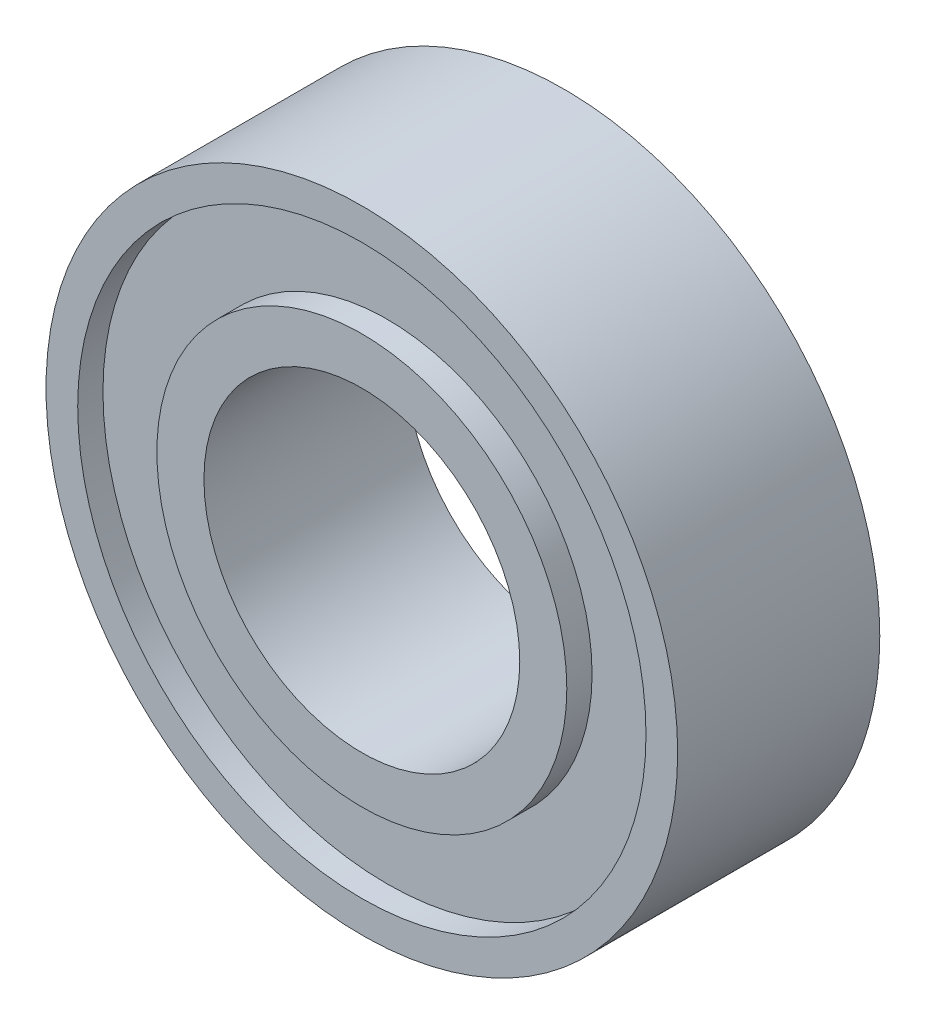
ISO-10303-21;
HEADER;
FILE_DESCRIPTION(('STEP AP214'),'2;1');
FILE_NAME('part.step','',(''),(''),'','','');
FILE_SCHEMA(('AUTOMOTIVE_DESIGN { 1 0 10303 214 1 1 1 1 }'));
ENDSEC;
DATA;
#1=APPLICATION_CONTEXT('core data for automotive mechanical design processes');
#2=APPLICATION_PROTOCOL_DEFINITION('international standard','automotive_design',2000,#1);
#3=PRODUCT_CONTEXT('',#1,'mechanical');
#4=PRODUCT('Part','Part','',(#3));
#5=PRODUCT_RELATED_PRODUCT_CATEGORY('part','',(#4));
#6=PRODUCT_DEFINITION_FORMATION('','',#4);
#7=PRODUCT_DEFINITION_CONTEXT('part definition',#1,'design');
#8=PRODUCT_DEFINITION('design','',#6,#7);
#9=PRODUCT_DEFINITION_SHAPE('','',#8);
#10=(LENGTH_UNIT() NAMED_UNIT(*) SI_UNIT(.MILLI.,.METRE.));
#11=(NAMED_UNIT(*) PLANE_ANGLE_UNIT() SI_UNIT($,.RADIAN.));
#12=(NAMED_UNIT(*) SI_UNIT($,.STERADIAN.) SOLID_ANGLE_UNIT());
#13=UNCERTAINTY_MEASURE_WITH_UNIT(LENGTH_MEASURE(1.E-05),#10,'distance_accuracy_value','');
#14=(GEOMETRIC_REPRESENTATION_CONTEXT(3) GLOBAL_UNCERTAINTY_ASSIGNED_CONTEXT((#13)) GLOBAL_UNIT_ASSIGNED_CONTEXT((#10,
#11,#12)) REPRESENTATION_CONTEXT('',''));
#15=CARTESIAN_POINT('',(0.,0.,0.));
#16=DIRECTION('',(0.,0.,1.));
#17=DIRECTION('',(1.,0.,0.));
#18=AXIS2_PLACEMENT_3D('',#15,#16,#17);
#19=CARTESIAN_POINT('',(0.,0.,0.));
#20=DIRECTION('',(0.,0.,1.));
#21=DIRECTION('',(1.,0.,0.));
#22=AXIS2_PLACEMENT_3D('',#19,#20,#21);
#23=PLANE('',#22);
#24=CARTESIAN_POINT('',(0.,0.,0.));
#25=DIRECTION('',(0.,0.,1.));
#26=DIRECTION('',(1.,0.,0.));
#27=AXIS2_PLACEMENT_3D('',#24,#25,#26);
#28=CIRCLE('',#27,6.25);
#29=CARTESIAN_POINT('',(6.25,0.,0.));
#30=VERTEX_POINT('',#29);
#31=EDGE_CURVE('E46',#30,#30,#28,.T.);
#32=ORIENTED_EDGE('',*,*,#31,.T.);
#33=EDGE_LOOP('',(#32));
#34=FACE_BOUND('',#33,.T.);
#35=CARTESIAN_POINT('',(0.,0.,0.));
#36=DIRECTION('',(0.,0.,1.));
#37=DIRECTION('',(1.,0.,0.));
#38=AXIS2_PLACEMENT_3D('',#35,#36,#37);
#39=CIRCLE('',#38,8.11248220827146);
#40=CARTESIAN_POINT('',(8.11248220827146,0.,0.));
#41=VERTEX_POINT('',#40);
#42=EDGE_CURVE('E68',#41,#41,#39,.T.);
#43=ORIENTED_EDGE('',*,*,#42,.F.);
#44=EDGE_LOOP('',(#43));
#45=FACE_BOUND('',#44,.T.);
#46=ADVANCED_FACE('F33',(#34,#45),#23,.F.);
#47=CARTESIAN_POINT('',(0.,0.,8.));
#48=DIRECTION('',(0.,0.,1.));
#49=DIRECTION('',(1.,0.,0.));
#50=AXIS2_PLACEMENT_3D('',#47,#48,#49);
#51=PLANE('',#50);
#52=CARTESIAN_POINT('',(0.,0.,8.));
#53=DIRECTION('',(0.,0.,1.));
#54=DIRECTION('',(1.,0.,0.));
#55=AXIS2_PLACEMENT_3D('',#52,#53,#54);
#56=CIRCLE('',#55,6.25);
#57=CARTESIAN_POINT('',(6.25,0.,8.));
#58=VERTEX_POINT('',#57);
#59=EDGE_CURVE('E44',#58,#58,#56,.T.);
#60=ORIENTED_EDGE('',*,*,#59,.F.);
#61=EDGE_LOOP('',(#60));
#62=FACE_BOUND('',#61,.T.);
#63=CARTESIAN_POINT('',(0.,0.,8.));
#64=DIRECTION('',(0.,0.,1.));
#65=DIRECTION('',(1.,0.,0.));
#66=AXIS2_PLACEMENT_3D('',#63,#64,#65);
#67=CIRCLE('',#66,8.11248220827146);
#68=CARTESIAN_POINT('',(8.11248220827146,0.,8.));
#69=VERTEX_POINT('',#68);
#70=EDGE_CURVE('E56',#69,#69,#67,.T.);
#71=ORIENTED_EDGE('',*,*,#70,.T.);
#72=EDGE_LOOP('',(#71));
#73=FACE_BOUND('',#72,.T.);
#74=ADVANCED_FACE('F88',(#62,#73),#51,.T.);
#75=CARTESIAN_POINT('',(0.,0.,8.));
#76=DIRECTION('',(0.,0.,1.));
#77=DIRECTION('',(1.,0.,0.));
#78=AXIS2_PLACEMENT_3D('',#75,#76,#77);
#79=CIRCLE('',#78,11.2464030689656);
#80=CARTESIAN_POINT('',(11.2464030689656,0.,8.));
#81=VERTEX_POINT('',#80);
#82=EDGE_CURVE('E52',#81,#81,#79,.T.);
#83=ORIENTED_EDGE('',*,*,#82,.F.);
#84=EDGE_LOOP('',(#83));
#85=FACE_BOUND('',#84,.T.);
#86=CARTESIAN_POINT('',(0.,0.,8.));
#87=DIRECTION('',(0.,0.,1.));
#88=DIRECTION('',(1.,0.,0.));
#89=AXIS2_PLACEMENT_3D('',#86,#87,#88);
#90=CIRCLE('',#89,12.5);
#91=CARTESIAN_POINT('',(12.5,0.,8.));
#92=VERTEX_POINT('',#91);
#93=EDGE_CURVE('E10',#92,#92,#90,.T.);
#94=ORIENTED_EDGE('',*,*,#93,.T.);
#95=EDGE_LOOP('',(#94));
#96=FACE_BOUND('',#95,.T.);
#97=ADVANCED_FACE('F94',(#85,#96),#51,.T.);
#98=CARTESIAN_POINT('',(0.,0.,0.));
#99=DIRECTION('',(0.,0.,1.));
#100=DIRECTION('',(1.,0.,0.));
#101=AXIS2_PLACEMENT_3D('',#98,#99,#100);
#102=CIRCLE('',#101,11.2464030689656);
#103=CARTESIAN_POINT('',(11.2464030689656,0.,0.));
#104=VERTEX_POINT('',#103);
#105=EDGE_CURVE('E64',#104,#104,#102,.T.);
#106=ORIENTED_EDGE('',*,*,#105,.T.);
#107=EDGE_LOOP('',(#106));
#108=FACE_BOUND('',#107,.T.);
#109=CARTESIAN_POINT('',(0.,0.,0.));
#110=DIRECTION('',(0.,0.,1.));
#111=DIRECTION('',(1.,0.,0.));
#112=AXIS2_PLACEMENT_3D('',#109,#110,#111);
#113=CIRCLE('',#112,12.5);
#114=CARTESIAN_POINT('',(12.5,0.,0.));
#115=VERTEX_POINT('',#114);
#116=EDGE_CURVE('E37',#115,#115,#113,.T.);
#117=ORIENTED_EDGE('',*,*,#116,.F.);
#118=EDGE_LOOP('',(#117));
#119=FACE_BOUND('',#118,.T.);
#120=ADVANCED_FACE('F90',(#108,#119),#23,.F.);
#121=CARTESIAN_POINT('',(0.,0.,8.));
#122=DIRECTION('',(0.,0.,-1.));
#123=DIRECTION('',(-1.,0.,0.));
#124=AXIS2_PLACEMENT_3D('',#121,#122,#123);
#125=CYLINDRICAL_SURFACE('',#124,12.5);
#126=ORIENTED_EDGE('',*,*,#93,.F.);
#127=EDGE_LOOP('',(#126));
#128=FACE_BOUND('',#127,.T.);
#129=ORIENTED_EDGE('',*,*,#116,.T.);
#130=EDGE_LOOP('',(#129));
#131=FACE_BOUND('',#130,.T.);
#132=ADVANCED_FACE('F35',(#128,#131),#125,.T.);
#133=CARTESIAN_POINT('',(0.,0.,8.));
#134=DIRECTION('',(0.,0.,-1.));
#135=DIRECTION('',(-1.,0.,0.));
#136=AXIS2_PLACEMENT_3D('',#133,#134,#135);
#137=CYLINDRICAL_SURFACE('',#136,6.25);
#138=ORIENTED_EDGE('',*,*,#59,.T.);
#139=EDGE_LOOP('',(#138));
#140=FACE_BOUND('',#139,.T.);
#141=ORIENTED_EDGE('',*,*,#31,.F.);
#142=EDGE_LOOP('',(#141));
#143=FACE_BOUND('',#142,.T.);
#144=ADVANCED_FACE('F103',(#140,#143),#137,.F.);
#145=CARTESIAN_POINT('',(0.,0.,7.));
#146=DIRECTION('',(0.,0.,1.));
#147=DIRECTION('',(1.,0.,0.));
#148=AXIS2_PLACEMENT_3D('',#145,#146,#147);
#149=CYLINDRICAL_SURFACE('',#148,8.11248220827146);
#150=CARTESIAN_POINT('',(0.,0.,7.));
#151=DIRECTION('',(0.,0.,1.));
#152=DIRECTION('',(1.,0.,0.));
#153=AXIS2_PLACEMENT_3D('',#150,#151,#152);
#154=CIRCLE('',#153,8.11248220827146);
#155=CARTESIAN_POINT('',(8.11248220827146,0.,7.));
#156=VERTEX_POINT('',#155);
#157=EDGE_CURVE('E55',#156,#156,#154,.T.);
#158=ORIENTED_EDGE('',*,*,#157,.T.);
#159=EDGE_LOOP('',(#158));
#160=FACE_BOUND('',#159,.T.);
#161=ORIENTED_EDGE('',*,*,#70,.F.);
#162=EDGE_LOOP('',(#161));
#163=FACE_BOUND('',#162,.T.);
#164=ADVANCED_FACE('F125',(#160,#163),#149,.T.);
#165=CARTESIAN_POINT('',(0.,0.,7.));
#166=DIRECTION('',(0.,0.,1.));
#167=DIRECTION('',(1.,0.,0.));
#168=AXIS2_PLACEMENT_3D('',#165,#166,#167);
#169=CYLINDRICAL_SURFACE('',#168,11.2464030689656);
#170=CARTESIAN_POINT('',(0.,0.,7.));
#171=DIRECTION('',(0.,0.,1.));
#172=DIRECTION('',(1.,0.,0.));
#173=AXIS2_PLACEMENT_3D('',#170,#171,#172);
#174=CIRCLE('',#173,11.2464030689656);
#175=CARTESIAN_POINT('',(11.2464030689656,0.,7.));
#176=VERTEX_POINT('',#175);
#177=EDGE_CURVE('E49',#176,#176,#174,.T.);
#178=ORIENTED_EDGE('',*,*,#177,.F.);
#179=EDGE_LOOP('',(#178));
#180=FACE_BOUND('',#179,.T.);
#181=ORIENTED_EDGE('',*,*,#82,.T.);
#182=EDGE_LOOP('',(#181));
#183=FACE_BOUND('',#182,.T.);
#184=ADVANCED_FACE('F121',(#180,#183),#169,.F.);
#185=CARTESIAN_POINT('',(0.,0.,7.));
#186=DIRECTION('',(0.,0.,1.));
#187=DIRECTION('',(1.,0.,0.));
#188=AXIS2_PLACEMENT_3D('',#185,#186,#187);
#189=PLANE('',#188);
#190=ORIENTED_EDGE('',*,*,#157,.F.);
#191=EDGE_LOOP('',(#190));
#192=FACE_BOUND('',#191,.T.);
#193=ORIENTED_EDGE('',*,*,#177,.T.);
#194=EDGE_LOOP('',(#193));
#195=FACE_BOUND('',#194,.T.);
#196=ADVANCED_FACE('F83',(#192,#195),#189,.T.);
#197=CARTESIAN_POINT('',(0.,0.,1.));
#198=DIRECTION('',(0.,0.,-1.));
#199=DIRECTION('',(-1.,0.,0.));
#200=AXIS2_PLACEMENT_3D('',#197,#198,#199);
#201=CYLINDRICAL_SURFACE('',#200,8.11248220827146);
#202=CARTESIAN_POINT('',(0.,0.,1.));
#203=DIRECTION('',(0.,0.,1.));
#204=DIRECTION('',(1.,0.,0.));
#205=AXIS2_PLACEMENT_3D('',#202,#203,#204);
#206=CIRCLE('',#205,8.11248220827146);
#207=CARTESIAN_POINT('',(8.11248220827146,0.,1.));
#208=VERTEX_POINT('',#207);
#209=EDGE_CURVE('E67',#208,#208,#206,.T.);
#210=ORIENTED_EDGE('',*,*,#209,.F.);
#211=EDGE_LOOP('',(#210));
#212=FACE_BOUND('',#211,.T.);
#213=ORIENTED_EDGE('',*,*,#42,.T.);
#214=EDGE_LOOP('',(#213));
#215=FACE_BOUND('',#214,.T.);
#216=ADVANCED_FACE('F79',(#212,#215),#201,.T.);
#217=CARTESIAN_POINT('',(0.,0.,1.));
#218=DIRECTION('',(0.,0.,-1.));
#219=DIRECTION('',(-1.,0.,0.));
#220=AXIS2_PLACEMENT_3D('',#217,#218,#219);
#221=CYLINDRICAL_SURFACE('',#220,11.2464030689656);
#222=CARTESIAN_POINT('',(0.,0.,1.));
#223=DIRECTION('',(0.,0.,1.));
#224=DIRECTION('',(1.,0.,0.));
#225=AXIS2_PLACEMENT_3D('',#222,#223,#224);
#226=CIRCLE('',#225,11.2464030689656);
#227=CARTESIAN_POINT('',(11.2464030689656,0.,1.));
#228=VERTEX_POINT('',#227);
#229=EDGE_CURVE('E59',#228,#228,#226,.T.);
#230=ORIENTED_EDGE('',*,*,#229,.T.);
#231=EDGE_LOOP('',(#230));
#232=FACE_BOUND('',#231,.T.);
#233=ORIENTED_EDGE('',*,*,#105,.F.);
#234=EDGE_LOOP('',(#233));
#235=FACE_BOUND('',#234,.T.);
#236=ADVANCED_FACE('F82',(#232,#235),#221,.F.);
#237=CARTESIAN_POINT('',(0.,0.,1.));
#238=DIRECTION('',(0.,0.,-1.));
#239=DIRECTION('',(1.,0.,0.));
#240=AXIS2_PLACEMENT_3D('',#237,#238,#239);
#241=PLANE('',#240);
#242=ORIENTED_EDGE('',*,*,#209,.T.);
#243=EDGE_LOOP('',(#242));
#244=FACE_BOUND('',#243,.T.);
#245=ORIENTED_EDGE('',*,*,#229,.F.);
#246=EDGE_LOOP('',(#245));
#247=FACE_BOUND('',#246,.T.);
#248=ADVANCED_FACE('F76',(#244,#247),#241,.T.);
#249=CLOSED_SHELL('',(#46,#74,#97,#120,#132,#144,#164,#184,#196,#216,#236,#248));
#250=MANIFOLD_SOLID_BREP('B2',#249);
#251=ADVANCED_BREP_SHAPE_REPRESENTATION('',(#18,#250),#14);
#252=SHAPE_DEFINITION_REPRESENTATION(#9,#251);
ENDSEC;
END-ISO-10303-21;
